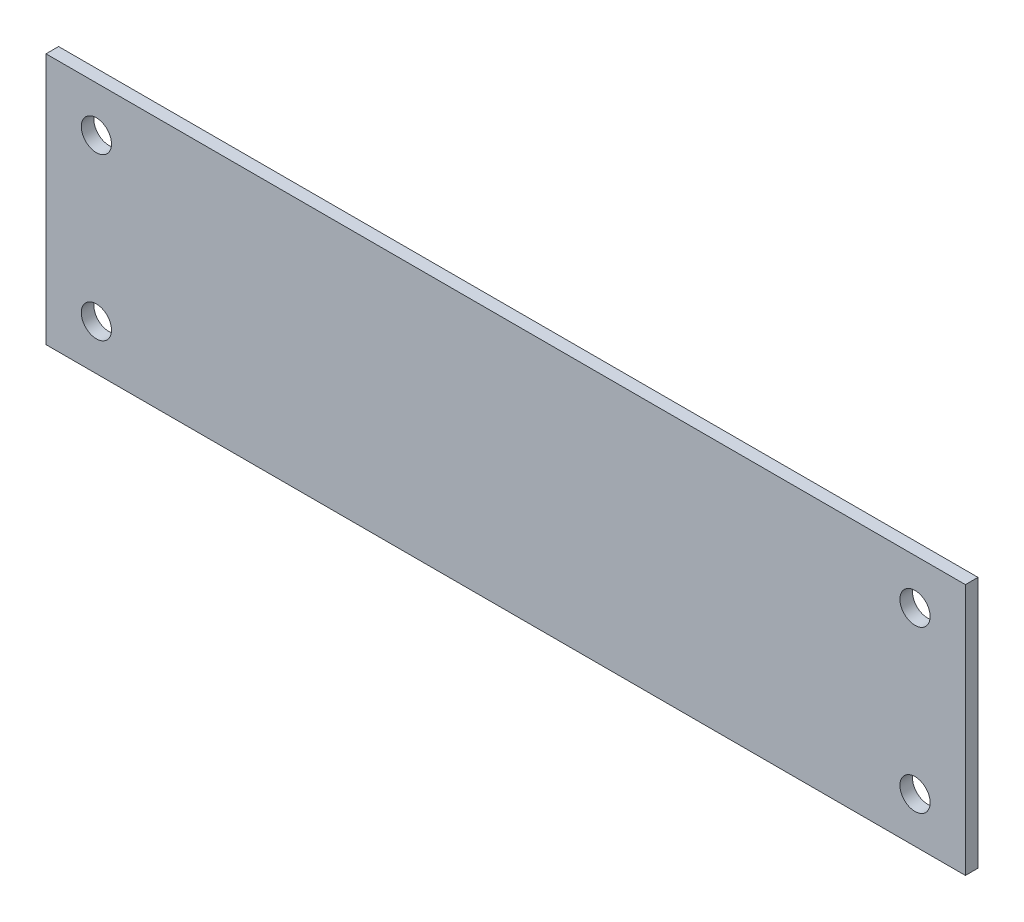
ISO-10303-21;
HEADER;
FILE_DESCRIPTION(('STEP AP214'),'2;1');
FILE_NAME('part.step','',(''),(''),'','','');
FILE_SCHEMA(('AUTOMOTIVE_DESIGN { 1 0 10303 214 1 1 1 1 }'));
ENDSEC;
DATA;
#1=APPLICATION_CONTEXT('core data for automotive mechanical design processes');
#2=APPLICATION_PROTOCOL_DEFINITION('international standard','automotive_design',2000,#1);
#3=PRODUCT_CONTEXT('',#1,'mechanical');
#4=PRODUCT('Part','Part','',(#3));
#5=PRODUCT_RELATED_PRODUCT_CATEGORY('part','',(#4));
#6=PRODUCT_DEFINITION_FORMATION('','',#4);
#7=PRODUCT_DEFINITION_CONTEXT('part definition',#1,'design');
#8=PRODUCT_DEFINITION('design','',#6,#7);
#9=PRODUCT_DEFINITION_SHAPE('','',#8);
#10=(LENGTH_UNIT() NAMED_UNIT(*) SI_UNIT(.MILLI.,.METRE.));
#11=(NAMED_UNIT(*) PLANE_ANGLE_UNIT() SI_UNIT($,.RADIAN.));
#12=(NAMED_UNIT(*) SI_UNIT($,.STERADIAN.) SOLID_ANGLE_UNIT());
#13=UNCERTAINTY_MEASURE_WITH_UNIT(LENGTH_MEASURE(1.E-05),#10,'distance_accuracy_value','');
#14=(GEOMETRIC_REPRESENTATION_CONTEXT(3) GLOBAL_UNCERTAINTY_ASSIGNED_CONTEXT((#13)) GLOBAL_UNIT_ASSIGNED_CONTEXT((#10,
#11,#12)) REPRESENTATION_CONTEXT('',''));
#15=CARTESIAN_POINT('',(0.,0.,0.));
#16=DIRECTION('',(0.,0.,1.));
#17=DIRECTION('',(1.,0.,0.));
#18=AXIS2_PLACEMENT_3D('',#15,#16,#17);
#19=CARTESIAN_POINT('',(0.,0.,5.));
#20=DIRECTION('',(0.,0.,1.));
#21=DIRECTION('',(1.,0.,0.));
#22=AXIS2_PLACEMENT_3D('',#19,#20,#21);
#23=PLANE('',#22);
#24=CARTESIAN_POINT('',(-162.5,32.,5.));
#25=DIRECTION('',(0.,0.,1.));
#26=DIRECTION('',(1.,0.,0.));
#27=AXIS2_PLACEMENT_3D('',#24,#25,#26);
#28=CIRCLE('',#27,6.00000000000002);
#29=CARTESIAN_POINT('',(-156.5,32.,5.));
#30=VERTEX_POINT('',#29);
#31=EDGE_CURVE('E126',#30,#30,#28,.T.);
#32=ORIENTED_EDGE('',*,*,#31,.F.);
#33=EDGE_LOOP('',(#32));
#34=FACE_BOUND('',#33,.T.);
#35=CARTESIAN_POINT('',(162.5,32.,5.));
#36=DIRECTION('',(0.,0.,1.));
#37=DIRECTION('',(1.,0.,0.));
#38=AXIS2_PLACEMENT_3D('',#35,#36,#37);
#39=CIRCLE('',#38,6.00000000000002);
#40=CARTESIAN_POINT('',(168.5,32.,5.));
#41=VERTEX_POINT('',#40);
#42=EDGE_CURVE('E105',#41,#41,#39,.T.);
#43=ORIENTED_EDGE('',*,*,#42,.F.);
#44=EDGE_LOOP('',(#43));
#45=FACE_BOUND('',#44,.T.);
#46=DIRECTION('',(0.,1.,0.));
#47=VECTOR('',#46,1.);
#48=CARTESIAN_POINT('',(182.5,50.,5.));
#49=LINE('',#48,#47);
#50=CARTESIAN_POINT('',(182.5,-50.,5.));
#51=VERTEX_POINT('',#50);
#52=CARTESIAN_POINT('',(182.5,50.,5.));
#53=VERTEX_POINT('',#52);
#54=EDGE_CURVE('E90',#51,#53,#49,.T.);
#55=ORIENTED_EDGE('',*,*,#54,.T.);
#56=DIRECTION('',(-1.,0.,0.));
#57=VECTOR('',#56,1.);
#58=CARTESIAN_POINT('',(-182.5,50.,5.));
#59=LINE('',#58,#57);
#60=CARTESIAN_POINT('',(-182.5,50.,5.));
#61=VERTEX_POINT('',#60);
#62=EDGE_CURVE('E85',#53,#61,#59,.T.);
#63=ORIENTED_EDGE('',*,*,#62,.T.);
#64=DIRECTION('',(0.,-1.,0.));
#65=VECTOR('',#64,1.);
#66=CARTESIAN_POINT('',(-182.5,50.,5.));
#67=LINE('',#66,#65);
#68=CARTESIAN_POINT('',(-182.5,-50.,5.));
#69=VERTEX_POINT('',#68);
#70=EDGE_CURVE('E88',#61,#69,#67,.T.);
#71=ORIENTED_EDGE('',*,*,#70,.T.);
#72=DIRECTION('',(1.,0.,0.));
#73=VECTOR('',#72,1.);
#74=CARTESIAN_POINT('',(-182.5,-50.,5.));
#75=LINE('',#74,#73);
#76=EDGE_CURVE('E55',#69,#51,#75,.T.);
#77=ORIENTED_EDGE('',*,*,#76,.T.);
#78=EDGE_LOOP('',(#55,#63,#71,#77));
#79=FACE_BOUND('',#78,.T.);
#80=CARTESIAN_POINT('',(162.5,-32.,5.));
#81=DIRECTION('',(0.,0.,1.));
#82=DIRECTION('',(1.,0.,0.));
#83=AXIS2_PLACEMENT_3D('',#80,#81,#82);
#84=CIRCLE('',#83,6.00000000000002);
#85=CARTESIAN_POINT('',(168.5,-32.,5.));
#86=VERTEX_POINT('',#85);
#87=EDGE_CURVE('E120',#86,#86,#84,.T.);
#88=ORIENTED_EDGE('',*,*,#87,.F.);
#89=EDGE_LOOP('',(#88));
#90=FACE_BOUND('',#89,.T.);
#91=CARTESIAN_POINT('',(-162.5,-32.,5.));
#92=DIRECTION('',(0.,0.,1.));
#93=DIRECTION('',(1.,0.,0.));
#94=AXIS2_PLACEMENT_3D('',#91,#92,#93);
#95=CIRCLE('',#94,6.00000000000002);
#96=CARTESIAN_POINT('',(-156.5,-32.,5.));
#97=VERTEX_POINT('',#96);
#98=EDGE_CURVE('E132',#97,#97,#95,.T.);
#99=ORIENTED_EDGE('',*,*,#98,.F.);
#100=EDGE_LOOP('',(#99));
#101=FACE_BOUND('',#100,.T.);
#102=ADVANCED_FACE('F38',(#34,#45,#79,#90,#101),#23,.T.);
#103=CARTESIAN_POINT('',(0.,0.,0.));
#104=DIRECTION('',(0.,0.,1.));
#105=DIRECTION('',(1.,0.,0.));
#106=AXIS2_PLACEMENT_3D('',#103,#104,#105);
#107=PLANE('',#106);
#108=DIRECTION('',(0.,1.,0.));
#109=VECTOR('',#108,1.);
#110=CARTESIAN_POINT('',(182.5,50.,0.));
#111=LINE('',#110,#109);
#112=CARTESIAN_POINT('',(182.5,-50.,0.));
#113=VERTEX_POINT('',#112);
#114=CARTESIAN_POINT('',(182.5,50.,0.));
#115=VERTEX_POINT('',#114);
#116=EDGE_CURVE('E102',#113,#115,#111,.T.);
#117=ORIENTED_EDGE('',*,*,#116,.F.);
#118=DIRECTION('',(1.,0.,0.));
#119=VECTOR('',#118,1.);
#120=CARTESIAN_POINT('',(-182.5,-50.,0.));
#121=LINE('',#120,#119);
#122=CARTESIAN_POINT('',(-182.5,-50.,0.));
#123=VERTEX_POINT('',#122);
#124=EDGE_CURVE('E78',#123,#113,#121,.T.);
#125=ORIENTED_EDGE('',*,*,#124,.F.);
#126=DIRECTION('',(0.,-1.,0.));
#127=VECTOR('',#126,1.);
#128=CARTESIAN_POINT('',(-182.5,50.,0.));
#129=LINE('',#128,#127);
#130=CARTESIAN_POINT('',(-182.5,50.,0.));
#131=VERTEX_POINT('',#130);
#132=EDGE_CURVE('E72',#131,#123,#129,.T.);
#133=ORIENTED_EDGE('',*,*,#132,.F.);
#134=DIRECTION('',(-1.,0.,0.));
#135=VECTOR('',#134,1.);
#136=CARTESIAN_POINT('',(-182.5,50.,0.));
#137=LINE('',#136,#135);
#138=EDGE_CURVE('E94',#115,#131,#137,.T.);
#139=ORIENTED_EDGE('',*,*,#138,.F.);
#140=EDGE_LOOP('',(#117,#125,#133,#139));
#141=FACE_BOUND('',#140,.T.);
#142=CARTESIAN_POINT('',(162.5,32.,0.));
#143=DIRECTION('',(0.,0.,1.));
#144=DIRECTION('',(1.,0.,0.));
#145=AXIS2_PLACEMENT_3D('',#142,#143,#144);
#146=CIRCLE('',#145,6.00000000000002);
#147=CARTESIAN_POINT('',(168.5,32.,0.));
#148=VERTEX_POINT('',#147);
#149=EDGE_CURVE('E117',#148,#148,#146,.T.);
#150=ORIENTED_EDGE('',*,*,#149,.T.);
#151=EDGE_LOOP('',(#150));
#152=FACE_BOUND('',#151,.T.);
#153=CARTESIAN_POINT('',(162.5,-32.,0.));
#154=DIRECTION('',(0.,0.,1.));
#155=DIRECTION('',(1.,0.,0.));
#156=AXIS2_PLACEMENT_3D('',#153,#154,#155);
#157=CIRCLE('',#156,6.00000000000002);
#158=CARTESIAN_POINT('',(168.5,-32.,0.));
#159=VERTEX_POINT('',#158);
#160=EDGE_CURVE('E123',#159,#159,#157,.T.);
#161=ORIENTED_EDGE('',*,*,#160,.T.);
#162=EDGE_LOOP('',(#161));
#163=FACE_BOUND('',#162,.T.);
#164=CARTESIAN_POINT('',(-162.5,32.,0.));
#165=DIRECTION('',(0.,0.,1.));
#166=DIRECTION('',(1.,0.,0.));
#167=AXIS2_PLACEMENT_3D('',#164,#165,#166);
#168=CIRCLE('',#167,6.00000000000002);
#169=CARTESIAN_POINT('',(-156.5,32.,0.));
#170=VERTEX_POINT('',#169);
#171=EDGE_CURVE('E129',#170,#170,#168,.T.);
#172=ORIENTED_EDGE('',*,*,#171,.T.);
#173=EDGE_LOOP('',(#172));
#174=FACE_BOUND('',#173,.T.);
#175=CARTESIAN_POINT('',(-162.5,-32.,0.));
#176=DIRECTION('',(0.,0.,1.));
#177=DIRECTION('',(1.,0.,0.));
#178=AXIS2_PLACEMENT_3D('',#175,#176,#177);
#179=CIRCLE('',#178,6.00000000000002);
#180=CARTESIAN_POINT('',(-156.5,-32.,0.));
#181=VERTEX_POINT('',#180);
#182=EDGE_CURVE('E135',#181,#181,#179,.T.);
#183=ORIENTED_EDGE('',*,*,#182,.T.);
#184=EDGE_LOOP('',(#183));
#185=FACE_BOUND('',#184,.T.);
#186=ADVANCED_FACE('F113',(#141,#152,#163,#174,#185),#107,.F.);
#187=CARTESIAN_POINT('',(182.5,50.,5.));
#188=DIRECTION('',(-1.,0.,0.));
#189=DIRECTION('',(0.,-1.,0.));
#190=AXIS2_PLACEMENT_3D('',#187,#188,#189);
#191=PLANE('',#190);
#192=ORIENTED_EDGE('',*,*,#116,.T.);
#193=DIRECTION('',(0.,0.,-1.));
#194=VECTOR('',#193,1.);
#195=CARTESIAN_POINT('',(182.5,50.,5.));
#196=LINE('',#195,#194);
#197=EDGE_CURVE('E11',#53,#115,#196,.T.);
#198=ORIENTED_EDGE('',*,*,#197,.F.);
#199=ORIENTED_EDGE('',*,*,#54,.F.);
#200=DIRECTION('',(0.,0.,-1.));
#201=VECTOR('',#200,1.);
#202=CARTESIAN_POINT('',(182.5,-50.,5.));
#203=LINE('',#202,#201);
#204=EDGE_CURVE('E98',#51,#113,#203,.T.);
#205=ORIENTED_EDGE('',*,*,#204,.T.);
#206=EDGE_LOOP('',(#192,#198,#199,#205));
#207=FACE_BOUND('',#206,.T.);
#208=ADVANCED_FACE('F40',(#207),#191,.F.);
#209=CARTESIAN_POINT('',(-182.5,50.,5.));
#210=DIRECTION('',(0.,-1.,0.));
#211=DIRECTION('',(0.,0.,-1.));
#212=AXIS2_PLACEMENT_3D('',#209,#210,#211);
#213=PLANE('',#212);
#214=ORIENTED_EDGE('',*,*,#138,.T.);
#215=DIRECTION('',(0.,0.,-1.));
#216=VECTOR('',#215,1.);
#217=CARTESIAN_POINT('',(-182.5,50.,5.));
#218=LINE('',#217,#216);
#219=EDGE_CURVE('E47',#61,#131,#218,.T.);
#220=ORIENTED_EDGE('',*,*,#219,.F.);
#221=ORIENTED_EDGE('',*,*,#62,.F.);
#222=ORIENTED_EDGE('',*,*,#197,.T.);
#223=EDGE_LOOP('',(#214,#220,#221,#222));
#224=FACE_BOUND('',#223,.T.);
#225=ADVANCED_FACE('F93',(#224),#213,.F.);
#226=CARTESIAN_POINT('',(-182.5,50.,5.));
#227=DIRECTION('',(1.,0.,0.));
#228=DIRECTION('',(0.,0.,-1.));
#229=AXIS2_PLACEMENT_3D('',#226,#227,#228);
#230=PLANE('',#229);
#231=ORIENTED_EDGE('',*,*,#132,.T.);
#232=DIRECTION('',(0.,0.,-1.));
#233=VECTOR('',#232,1.);
#234=CARTESIAN_POINT('',(-182.5,-50.,5.));
#235=LINE('',#234,#233);
#236=EDGE_CURVE('E95',#69,#123,#235,.T.);
#237=ORIENTED_EDGE('',*,*,#236,.F.);
#238=ORIENTED_EDGE('',*,*,#70,.F.);
#239=ORIENTED_EDGE('',*,*,#219,.T.);
#240=EDGE_LOOP('',(#231,#237,#238,#239));
#241=FACE_BOUND('',#240,.T.);
#242=ADVANCED_FACE('F96',(#241),#230,.F.);
#243=CARTESIAN_POINT('',(-182.5,-50.,5.));
#244=DIRECTION('',(0.,1.,0.));
#245=DIRECTION('',(0.,0.,1.));
#246=AXIS2_PLACEMENT_3D('',#243,#244,#245);
#247=PLANE('',#246);
#248=ORIENTED_EDGE('',*,*,#124,.T.);
#249=ORIENTED_EDGE('',*,*,#204,.F.);
#250=ORIENTED_EDGE('',*,*,#76,.F.);
#251=ORIENTED_EDGE('',*,*,#236,.T.);
#252=EDGE_LOOP('',(#248,#249,#250,#251));
#253=FACE_BOUND('',#252,.T.);
#254=ADVANCED_FACE('F110',(#253),#247,.F.);
#255=CARTESIAN_POINT('',(162.5,32.,5.));
#256=DIRECTION('',(0.,0.,-1.));
#257=DIRECTION('',(-1.,0.,0.));
#258=AXIS2_PLACEMENT_3D('',#255,#256,#257);
#259=CYLINDRICAL_SURFACE('',#258,6.00000000000002);
#260=ORIENTED_EDGE('',*,*,#42,.T.);
#261=EDGE_LOOP('',(#260));
#262=FACE_BOUND('',#261,.T.);
#263=ORIENTED_EDGE('',*,*,#149,.F.);
#264=EDGE_LOOP('',(#263));
#265=FACE_BOUND('',#264,.T.);
#266=ADVANCED_FACE('F154',(#262,#265),#259,.F.);
#267=CARTESIAN_POINT('',(162.5,-32.,5.));
#268=DIRECTION('',(0.,0.,-1.));
#269=DIRECTION('',(-1.,0.,0.));
#270=AXIS2_PLACEMENT_3D('',#267,#268,#269);
#271=CYLINDRICAL_SURFACE('',#270,6.00000000000002);
#272=ORIENTED_EDGE('',*,*,#87,.T.);
#273=EDGE_LOOP('',(#272));
#274=FACE_BOUND('',#273,.T.);
#275=ORIENTED_EDGE('',*,*,#160,.F.);
#276=EDGE_LOOP('',(#275));
#277=FACE_BOUND('',#276,.T.);
#278=ADVANCED_FACE('F199',(#274,#277),#271,.F.);
#279=CARTESIAN_POINT('',(-162.5,32.,5.));
#280=DIRECTION('',(0.,0.,-1.));
#281=DIRECTION('',(-1.,0.,0.));
#282=AXIS2_PLACEMENT_3D('',#279,#280,#281);
#283=CYLINDRICAL_SURFACE('',#282,6.00000000000002);
#284=ORIENTED_EDGE('',*,*,#31,.T.);
#285=EDGE_LOOP('',(#284));
#286=FACE_BOUND('',#285,.T.);
#287=ORIENTED_EDGE('',*,*,#171,.F.);
#288=EDGE_LOOP('',(#287));
#289=FACE_BOUND('',#288,.T.);
#290=ADVANCED_FACE('F207',(#286,#289),#283,.F.);
#291=CARTESIAN_POINT('',(-162.5,-32.,5.));
#292=DIRECTION('',(0.,0.,-1.));
#293=DIRECTION('',(-1.,0.,0.));
#294=AXIS2_PLACEMENT_3D('',#291,#292,#293);
#295=CYLINDRICAL_SURFACE('',#294,6.00000000000002);
#296=ORIENTED_EDGE('',*,*,#98,.T.);
#297=EDGE_LOOP('',(#296));
#298=FACE_BOUND('',#297,.T.);
#299=ORIENTED_EDGE('',*,*,#182,.F.);
#300=EDGE_LOOP('',(#299));
#301=FACE_BOUND('',#300,.T.);
#302=ADVANCED_FACE('F141',(#298,#301),#295,.F.);
#303=CLOSED_SHELL('',(#102,#186,#208,#225,#242,#254,#266,#278,#290,#302));
#304=MANIFOLD_SOLID_BREP('B2',#303);
#305=ADVANCED_BREP_SHAPE_REPRESENTATION('',(#18,#304),#14);
#306=SHAPE_DEFINITION_REPRESENTATION(#9,#305);
ENDSEC;
END-ISO-10303-21;
